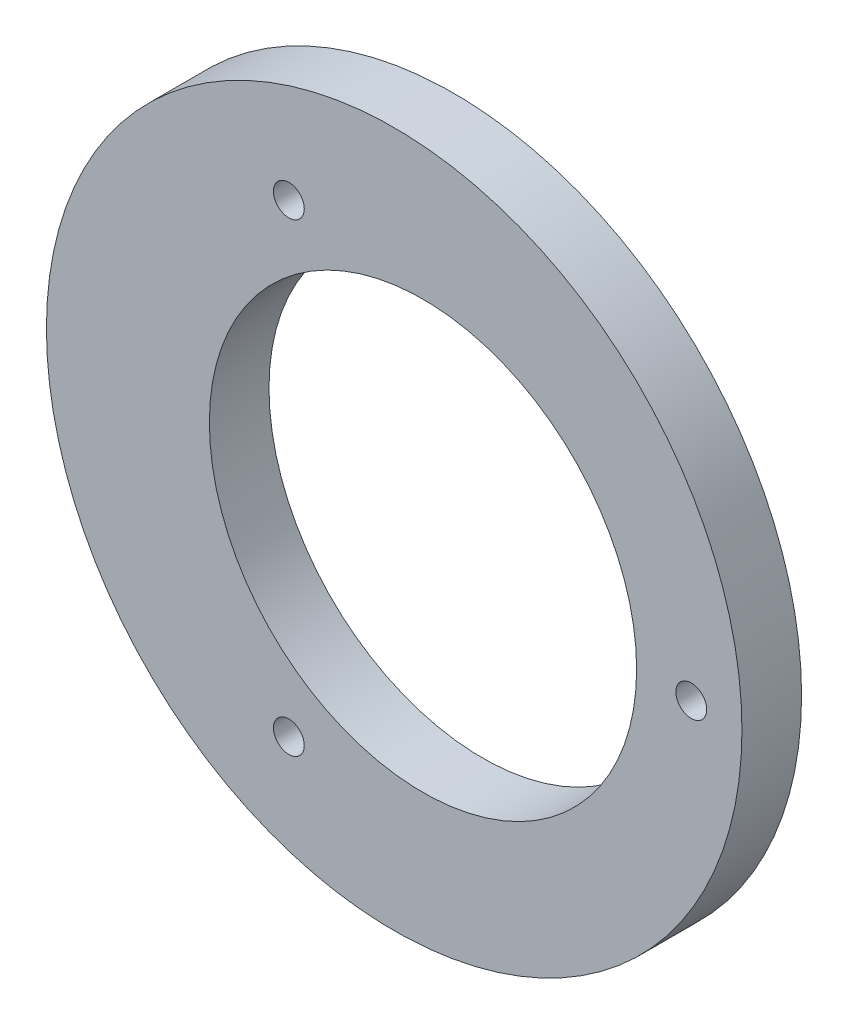
ISO-10303-21;
HEADER;
FILE_DESCRIPTION(('STEP AP214'),'2;1');
FILE_NAME('part.step','',(''),(''),'','','');
FILE_SCHEMA(('AUTOMOTIVE_DESIGN { 1 0 10303 214 1 1 1 1 }'));
ENDSEC;
DATA;
#1=APPLICATION_CONTEXT('core data for automotive mechanical design processes');
#2=APPLICATION_PROTOCOL_DEFINITION('international standard','automotive_design',2000,#1);
#3=PRODUCT_CONTEXT('',#1,'mechanical');
#4=PRODUCT('Part','Part','',(#3));
#5=PRODUCT_RELATED_PRODUCT_CATEGORY('part','',(#4));
#6=PRODUCT_DEFINITION_FORMATION('','',#4);
#7=PRODUCT_DEFINITION_CONTEXT('part definition',#1,'design');
#8=PRODUCT_DEFINITION('design','',#6,#7);
#9=PRODUCT_DEFINITION_SHAPE('','',#8);
#10=(LENGTH_UNIT() NAMED_UNIT(*) SI_UNIT(.MILLI.,.METRE.));
#11=(NAMED_UNIT(*) PLANE_ANGLE_UNIT() SI_UNIT($,.RADIAN.));
#12=(NAMED_UNIT(*) SI_UNIT($,.STERADIAN.) SOLID_ANGLE_UNIT());
#13=UNCERTAINTY_MEASURE_WITH_UNIT(LENGTH_MEASURE(1.E-05),#10,'distance_accuracy_value','');
#14=(GEOMETRIC_REPRESENTATION_CONTEXT(3) GLOBAL_UNCERTAINTY_ASSIGNED_CONTEXT((#13)) GLOBAL_UNIT_ASSIGNED_CONTEXT((#10,
#11,#12)) REPRESENTATION_CONTEXT('',''));
#15=CARTESIAN_POINT('',(0.,0.,0.));
#16=DIRECTION('',(0.,0.,1.));
#17=DIRECTION('',(1.,0.,0.));
#18=AXIS2_PLACEMENT_3D('',#15,#16,#17);
#19=CARTESIAN_POINT('',(41.7198398706375,20.3846706625654,6.));
#20=DIRECTION('',(0.,0.,-1.));
#21=DIRECTION('',(-1.,0.,0.));
#22=AXIS2_PLACEMENT_3D('',#19,#20,#21);
#23=CYLINDRICAL_SURFACE('',#22,35.);
#24=CARTESIAN_POINT('',(41.7198398706375,20.3846706625654,6.));
#25=DIRECTION('',(0.,0.,1.));
#26=DIRECTION('',(1.,0.,0.));
#27=AXIS2_PLACEMENT_3D('',#24,#25,#26);
#28=CIRCLE('',#27,35.);
#29=CARTESIAN_POINT('',(76.7198398706375,20.3846706625654,6.));
#30=VERTEX_POINT('',#29);
#31=EDGE_CURVE('E10',#30,#30,#28,.T.);
#32=ORIENTED_EDGE('',*,*,#31,.F.);
#33=EDGE_LOOP('',(#32));
#34=FACE_BOUND('',#33,.T.);
#35=CARTESIAN_POINT('',(41.7198398706375,20.3846706625654,0.));
#36=DIRECTION('',(0.,0.,1.));
#37=DIRECTION('',(1.,0.,0.));
#38=AXIS2_PLACEMENT_3D('',#35,#36,#37);
#39=CIRCLE('',#38,35.);
#40=CARTESIAN_POINT('',(76.7198398706375,20.3846706625654,0.));
#41=VERTEX_POINT('',#40);
#42=EDGE_CURVE('E36',#41,#41,#39,.T.);
#43=ORIENTED_EDGE('',*,*,#42,.T.);
#44=EDGE_LOOP('',(#43));
#45=FACE_BOUND('',#44,.T.);
#46=ADVANCED_FACE('F33',(#34,#45),#23,.T.);
#47=CARTESIAN_POINT('',(41.7198398706375,20.3846706625654,6.));
#48=DIRECTION('',(0.,0.,1.));
#49=DIRECTION('',(1.,0.,0.));
#50=AXIS2_PLACEMENT_3D('',#47,#48,#49);
#51=PLANE('',#50);
#52=CARTESIAN_POINT('',(31.1198398706376,43.7673565647851,6.));
#53=DIRECTION('',(0.,0.,1.));
#54=DIRECTION('',(1.,0.,0.));
#55=AXIS2_PLACEMENT_3D('',#52,#53,#54);
#56=CIRCLE('',#55,1.54999999999999);
#57=CARTESIAN_POINT('',(32.6698398706376,43.7673565647851,6.));
#58=VERTEX_POINT('',#57);
#59=EDGE_CURVE('E63',#58,#58,#56,.T.);
#60=ORIENTED_EDGE('',*,*,#59,.F.);
#61=EDGE_LOOP('',(#60));
#62=FACE_BOUND('',#61,.T.);
#63=CARTESIAN_POINT('',(71.6198398706376,20.3846706626052,6.));
#64=DIRECTION('',(0.,0.,1.));
#65=DIRECTION('',(1.,0.,0.));
#66=AXIS2_PLACEMENT_3D('',#63,#64,#65);
#67=CIRCLE('',#66,1.55000000000001);
#68=CARTESIAN_POINT('',(73.1698398706376,20.3846706626052,6.));
#69=VERTEX_POINT('',#68);
#70=EDGE_CURVE('E57',#69,#69,#67,.T.);
#71=ORIENTED_EDGE('',*,*,#70,.F.);
#72=EDGE_LOOP('',(#71));
#73=FACE_BOUND('',#72,.T.);
#74=CARTESIAN_POINT('',(31.1198398706374,-2.99801523957457,6.));
#75=DIRECTION('',(0.,0.,1.));
#76=DIRECTION('',(1.,0.,0.));
#77=AXIS2_PLACEMENT_3D('',#74,#75,#76);
#78=CIRCLE('',#77,1.55);
#79=CARTESIAN_POINT('',(32.6698398706375,-2.99801523957457,6.));
#80=VERTEX_POINT('',#79);
#81=EDGE_CURVE('E51',#80,#80,#78,.T.);
#82=ORIENTED_EDGE('',*,*,#81,.F.);
#83=EDGE_LOOP('',(#82));
#84=FACE_BOUND('',#83,.T.);
#85=CARTESIAN_POINT('',(44.6198398706376,20.3846706625654,6.));
#86=DIRECTION('',(0.,0.,1.));
#87=DIRECTION('',(1.,0.,0.));
#88=AXIS2_PLACEMENT_3D('',#85,#86,#87);
#89=CIRCLE('',#88,21.5);
#90=CARTESIAN_POINT('',(66.1198398706375,20.3846706625654,6.));
#91=VERTEX_POINT('',#90);
#92=EDGE_CURVE('E45',#91,#91,#89,.T.);
#93=ORIENTED_EDGE('',*,*,#92,.F.);
#94=EDGE_LOOP('',(#93));
#95=FACE_BOUND('',#94,.T.);
#96=ORIENTED_EDGE('',*,*,#31,.T.);
#97=EDGE_LOOP('',(#96));
#98=FACE_BOUND('',#97,.T.);
#99=ADVANCED_FACE('F79',(#62,#73,#84,#95,#98),#51,.T.);
#100=CARTESIAN_POINT('',(41.7198398706375,20.3846706625654,0.));
#101=DIRECTION('',(0.,0.,1.));
#102=DIRECTION('',(1.,0.,0.));
#103=AXIS2_PLACEMENT_3D('',#100,#101,#102);
#104=PLANE('',#103);
#105=CARTESIAN_POINT('',(31.1198398706376,43.7673565647851,0.));
#106=DIRECTION('',(0.,0.,1.));
#107=DIRECTION('',(1.,0.,0.));
#108=AXIS2_PLACEMENT_3D('',#105,#106,#107);
#109=CIRCLE('',#108,1.54999999999999);
#110=CARTESIAN_POINT('',(32.6698398706376,43.7673565647851,0.));
#111=VERTEX_POINT('',#110);
#112=EDGE_CURVE('E60',#111,#111,#109,.T.);
#113=ORIENTED_EDGE('',*,*,#112,.T.);
#114=EDGE_LOOP('',(#113));
#115=FACE_BOUND('',#114,.T.);
#116=CARTESIAN_POINT('',(71.6198398706376,20.3846706626052,0.));
#117=DIRECTION('',(0.,0.,1.));
#118=DIRECTION('',(1.,0.,0.));
#119=AXIS2_PLACEMENT_3D('',#116,#117,#118);
#120=CIRCLE('',#119,1.55000000000001);
#121=CARTESIAN_POINT('',(73.1698398706376,20.3846706626052,0.));
#122=VERTEX_POINT('',#121);
#123=EDGE_CURVE('E54',#122,#122,#120,.T.);
#124=ORIENTED_EDGE('',*,*,#123,.T.);
#125=EDGE_LOOP('',(#124));
#126=FACE_BOUND('',#125,.T.);
#127=CARTESIAN_POINT('',(31.1198398706374,-2.99801523957457,0.));
#128=DIRECTION('',(0.,0.,1.));
#129=DIRECTION('',(1.,0.,0.));
#130=AXIS2_PLACEMENT_3D('',#127,#128,#129);
#131=CIRCLE('',#130,1.55);
#132=CARTESIAN_POINT('',(32.6698398706375,-2.99801523957457,0.));
#133=VERTEX_POINT('',#132);
#134=EDGE_CURVE('E48',#133,#133,#131,.T.);
#135=ORIENTED_EDGE('',*,*,#134,.T.);
#136=EDGE_LOOP('',(#135));
#137=FACE_BOUND('',#136,.T.);
#138=CARTESIAN_POINT('',(44.6198398706376,20.3846706625654,0.));
#139=DIRECTION('',(0.,0.,1.));
#140=DIRECTION('',(1.,0.,0.));
#141=AXIS2_PLACEMENT_3D('',#138,#139,#140);
#142=CIRCLE('',#141,21.5);
#143=CARTESIAN_POINT('',(66.1198398706375,20.3846706625654,0.));
#144=VERTEX_POINT('',#143);
#145=EDGE_CURVE('E43',#144,#144,#142,.T.);
#146=ORIENTED_EDGE('',*,*,#145,.T.);
#147=EDGE_LOOP('',(#146));
#148=FACE_BOUND('',#147,.T.);
#149=ORIENTED_EDGE('',*,*,#42,.F.);
#150=EDGE_LOOP('',(#149));
#151=FACE_BOUND('',#150,.T.);
#152=ADVANCED_FACE('F69',(#115,#126,#137,#148,#151),#104,.F.);
#153=CARTESIAN_POINT('',(44.6198398706376,20.3846706625654,0.));
#154=DIRECTION('',(0.,0.,1.));
#155=DIRECTION('',(1.,0.,0.));
#156=AXIS2_PLACEMENT_3D('',#153,#154,#155);
#157=CYLINDRICAL_SURFACE('',#156,21.5);
#158=ORIENTED_EDGE('',*,*,#145,.F.);
#159=EDGE_LOOP('',(#158));
#160=FACE_BOUND('',#159,.T.);
#161=ORIENTED_EDGE('',*,*,#92,.T.);
#162=EDGE_LOOP('',(#161));
#163=FACE_BOUND('',#162,.T.);
#164=ADVANCED_FACE('F89',(#160,#163),#157,.F.);
#165=CARTESIAN_POINT('',(31.1198398706374,-2.99801523957457,0.));
#166=DIRECTION('',(0.,0.,1.));
#167=DIRECTION('',(1.,0.,0.));
#168=AXIS2_PLACEMENT_3D('',#165,#166,#167);
#169=CYLINDRICAL_SURFACE('',#168,1.55);
#170=ORIENTED_EDGE('',*,*,#134,.F.);
#171=EDGE_LOOP('',(#170));
#172=FACE_BOUND('',#171,.T.);
#173=ORIENTED_EDGE('',*,*,#81,.T.);
#174=EDGE_LOOP('',(#173));
#175=FACE_BOUND('',#174,.T.);
#176=ADVANCED_FACE('F91',(#172,#175),#169,.F.);
#177=CARTESIAN_POINT('',(71.6198398706376,20.3846706626052,0.));
#178=DIRECTION('',(0.,0.,1.));
#179=DIRECTION('',(1.,0.,0.));
#180=AXIS2_PLACEMENT_3D('',#177,#178,#179);
#181=CYLINDRICAL_SURFACE('',#180,1.55000000000001);
#182=ORIENTED_EDGE('',*,*,#123,.F.);
#183=EDGE_LOOP('',(#182));
#184=FACE_BOUND('',#183,.T.);
#185=ORIENTED_EDGE('',*,*,#70,.T.);
#186=EDGE_LOOP('',(#185));
#187=FACE_BOUND('',#186,.T.);
#188=ADVANCED_FACE('F75',(#184,#187),#181,.F.);
#189=CARTESIAN_POINT('',(31.1198398706376,43.7673565647851,0.));
#190=DIRECTION('',(0.,0.,1.));
#191=DIRECTION('',(1.,0.,0.));
#192=AXIS2_PLACEMENT_3D('',#189,#190,#191);
#193=CYLINDRICAL_SURFACE('',#192,1.54999999999999);
#194=ORIENTED_EDGE('',*,*,#112,.F.);
#195=EDGE_LOOP('',(#194));
#196=FACE_BOUND('',#195,.T.);
#197=ORIENTED_EDGE('',*,*,#59,.T.);
#198=EDGE_LOOP('',(#197));
#199=FACE_BOUND('',#198,.T.);
#200=ADVANCED_FACE('F72',(#196,#199),#193,.F.);
#201=CLOSED_SHELL('',(#46,#99,#152,#164,#176,#188,#200));
#202=MANIFOLD_SOLID_BREP('B2',#201);
#203=ADVANCED_BREP_SHAPE_REPRESENTATION('',(#18,#202),#14);
#204=SHAPE_DEFINITION_REPRESENTATION(#9,#203);
ENDSEC;
END-ISO-10303-21;
